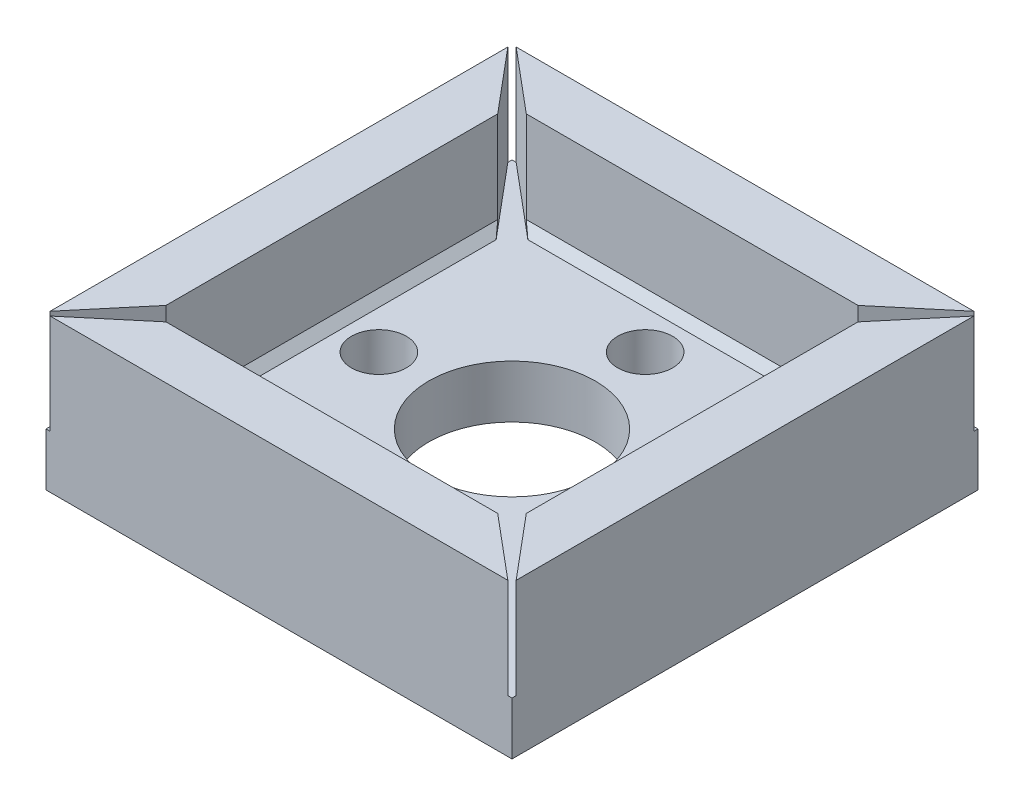
ISO-10303-21;
HEADER;
FILE_DESCRIPTION(('STEP AP214'),'2;1');
FILE_NAME('part.step','',(''),(''),'','','');
FILE_SCHEMA(('AUTOMOTIVE_DESIGN { 1 0 10303 214 1 1 1 1 }'));
ENDSEC;
DATA;
#1=APPLICATION_CONTEXT('core data for automotive mechanical design processes');
#2=APPLICATION_PROTOCOL_DEFINITION('international standard','automotive_design',2000,#1);
#3=PRODUCT_CONTEXT('',#1,'mechanical');
#4=PRODUCT('Part','Part','',(#3));
#5=PRODUCT_RELATED_PRODUCT_CATEGORY('part','',(#4));
#6=PRODUCT_DEFINITION_FORMATION('','',#4);
#7=PRODUCT_DEFINITION_CONTEXT('part definition',#1,'design');
#8=PRODUCT_DEFINITION('design','',#6,#7);
#9=PRODUCT_DEFINITION_SHAPE('','',#8);
#10=(LENGTH_UNIT() NAMED_UNIT(*) SI_UNIT(.MILLI.,.METRE.));
#11=(NAMED_UNIT(*) PLANE_ANGLE_UNIT() SI_UNIT($,.RADIAN.));
#12=(NAMED_UNIT(*) SI_UNIT($,.STERADIAN.) SOLID_ANGLE_UNIT());
#13=UNCERTAINTY_MEASURE_WITH_UNIT(LENGTH_MEASURE(1.E-05),#10,'distance_accuracy_value','');
#14=(GEOMETRIC_REPRESENTATION_CONTEXT(3) GLOBAL_UNCERTAINTY_ASSIGNED_CONTEXT((#13)) GLOBAL_UNIT_ASSIGNED_CONTEXT((#10,
#11,#12)) REPRESENTATION_CONTEXT('',''));
#15=CARTESIAN_POINT('',(0.,0.,0.));
#16=DIRECTION('',(0.,0.,1.));
#17=DIRECTION('',(1.,0.,0.));
#18=AXIS2_PLACEMENT_3D('',#15,#16,#17);
#19=CARTESIAN_POINT('',(0.,3.175,0.));
#20=DIRECTION('',(0.,-1.,0.));
#21=DIRECTION('',(0.,0.,-1.));
#22=AXIS2_PLACEMENT_3D('',#19,#20,#21);
#23=PLANE('',#22);
#24=CARTESIAN_POINT('',(8.,3.175,0.));
#25=DIRECTION('',(0.,1.,0.));
#26=DIRECTION('',(0.,0.,1.));
#27=AXIS2_PLACEMENT_3D('',#24,#25,#26);
#28=CIRCLE('',#27,1.64999999999999);
#29=CARTESIAN_POINT('',(8.,3.175,1.64999999999998));
#30=VERTEX_POINT('',#29);
#31=EDGE_CURVE('E346',#30,#30,#28,.T.);
#32=ORIENTED_EDGE('',*,*,#31,.F.);
#33=EDGE_LOOP('',(#32));
#34=FACE_BOUND('',#33,.T.);
#35=CARTESIAN_POINT('',(0.,3.175,7.99999999999999));
#36=DIRECTION('',(0.,1.,0.));
#37=DIRECTION('',(0.,0.,1.));
#38=AXIS2_PLACEMENT_3D('',#35,#36,#37);
#39=CIRCLE('',#38,1.64999999999999);
#40=CARTESIAN_POINT('',(0.,3.175,9.64999999999998));
#41=VERTEX_POINT('',#40);
#42=EDGE_CURVE('E351',#41,#41,#39,.T.);
#43=ORIENTED_EDGE('',*,*,#42,.F.);
#44=EDGE_LOOP('',(#43));
#45=FACE_BOUND('',#44,.T.);
#46=CARTESIAN_POINT('',(-8.,3.175,0.));
#47=DIRECTION('',(0.,1.,0.));
#48=DIRECTION('',(0.,0.,1.));
#49=AXIS2_PLACEMENT_3D('',#46,#47,#48);
#50=CIRCLE('',#49,1.64999999999999);
#51=CARTESIAN_POINT('',(-8.,3.175,1.64999999999993));
#52=VERTEX_POINT('',#51);
#53=EDGE_CURVE('E359',#52,#52,#50,.T.);
#54=ORIENTED_EDGE('',*,*,#53,.F.);
#55=EDGE_LOOP('',(#54));
#56=FACE_BOUND('',#55,.T.);
#57=CARTESIAN_POINT('',(0.,3.175,-8.00000000000001));
#58=DIRECTION('',(0.,1.,0.));
#59=DIRECTION('',(0.,0.,1.));
#60=AXIS2_PLACEMENT_3D('',#57,#58,#59);
#61=CIRCLE('',#60,1.64999999999999);
#62=CARTESIAN_POINT('',(0.,3.175,-6.35000000000002));
#63=VERTEX_POINT('',#62);
#64=EDGE_CURVE('E364',#63,#63,#61,.T.);
#65=ORIENTED_EDGE('',*,*,#64,.F.);
#66=EDGE_LOOP('',(#65));
#67=FACE_BOUND('',#66,.T.);
#68=CARTESIAN_POINT('',(0.,3.175,0.));
#69=DIRECTION('',(0.,1.,0.));
#70=DIRECTION('',(0.,0.,1.));
#71=AXIS2_PLACEMENT_3D('',#68,#69,#70);
#72=CIRCLE('',#71,5.);
#73=CARTESIAN_POINT('',(0.,3.175,5.));
#74=VERTEX_POINT('',#73);
#75=EDGE_CURVE('E372',#74,#74,#72,.T.);
#76=ORIENTED_EDGE('',*,*,#75,.F.);
#77=EDGE_LOOP('',(#76));
#78=FACE_BOUND('',#77,.T.);
#79=DIRECTION('',(-0.766044443118974,0.,0.642787609686544));
#80=VECTOR('',#79,1.);
#81=CARTESIAN_POINT('',(-13.75,3.175,14.));
#82=LINE('',#81,#80);
#83=CARTESIAN_POINT('',(-9.37030554721633,3.175,10.325));
#84=VERTEX_POINT('',#83);
#85=CARTESIAN_POINT('',(-13.75,3.175,14.));
#86=VERTEX_POINT('',#85);
#87=EDGE_CURVE('E310',#84,#86,#82,.T.);
#88=ORIENTED_EDGE('',*,*,#87,.F.);
#89=DIRECTION('',(1.,0.,0.));
#90=VECTOR('',#89,1.);
#91=CARTESIAN_POINT('',(9.96618234351338,3.175,10.325));
#92=LINE('',#91,#90);
#93=CARTESIAN_POINT('',(9.37030554721627,3.175,10.325));
#94=VERTEX_POINT('',#93);
#95=EDGE_CURVE('E447',#84,#94,#92,.T.);
#96=ORIENTED_EDGE('',*,*,#95,.T.);
#97=DIRECTION('',(-0.766044443118979,0.,-0.642787609686538));
#98=VECTOR('',#97,1.);
#99=CARTESIAN_POINT('',(13.75,3.175,14.));
#100=LINE('',#99,#98);
#101=CARTESIAN_POINT('',(13.75,3.175,14.));
#102=VERTEX_POINT('',#101);
#103=EDGE_CURVE('E316',#102,#94,#100,.T.);
#104=ORIENTED_EDGE('',*,*,#103,.F.);
#105=DIRECTION('',(1.,0.,0.));
#106=VECTOR('',#105,1.);
#107=CARTESIAN_POINT('',(-14.,3.175,14.));
#108=LINE('',#107,#106);
#109=CARTESIAN_POINT('',(14.,3.175,14.));
#110=VERTEX_POINT('',#109);
#111=EDGE_CURVE('E393',#102,#110,#108,.T.);
#112=ORIENTED_EDGE('',*,*,#111,.T.);
#113=DIRECTION('',(0.,0.,-1.));
#114=VECTOR('',#113,1.);
#115=CARTESIAN_POINT('',(14.,3.175,14.));
#116=LINE('',#115,#114);
#117=CARTESIAN_POINT('',(14.,3.175,13.75));
#118=VERTEX_POINT('',#117);
#119=EDGE_CURVE('E381',#110,#118,#116,.T.);
#120=ORIENTED_EDGE('',*,*,#119,.T.);
#121=DIRECTION('',(0.642787609686546,0.,0.766044443118972));
#122=VECTOR('',#121,1.);
#123=CARTESIAN_POINT('',(14.,3.175,13.75));
#124=LINE('',#123,#122);
#125=CARTESIAN_POINT('',(10.325,3.175,9.3703055472163));
#126=VERTEX_POINT('',#125);
#127=EDGE_CURVE('E274',#126,#118,#124,.T.);
#128=ORIENTED_EDGE('',*,*,#127,.F.);
#129=DIRECTION('',(0.,0.,-1.));
#130=VECTOR('',#129,1.);
#131=CARTESIAN_POINT('',(10.325,3.175,-9.96618234351341));
#132=LINE('',#131,#130);
#133=CARTESIAN_POINT('',(10.325,3.175,-9.37030554721631));
#134=VERTEX_POINT('',#133);
#135=EDGE_CURVE('E443',#126,#134,#132,.T.);
#136=ORIENTED_EDGE('',*,*,#135,.T.);
#137=DIRECTION('',(-0.642787609686535,0.,0.766044443118981));
#138=VECTOR('',#137,1.);
#139=CARTESIAN_POINT('',(13.9999999999999,3.175,-13.75));
#140=LINE('',#139,#138);
#141=CARTESIAN_POINT('',(13.9999999999999,3.175,-13.75));
#142=VERTEX_POINT('',#141);
#143=EDGE_CURVE('E280',#142,#134,#140,.T.);
#144=ORIENTED_EDGE('',*,*,#143,.F.);
#145=CARTESIAN_POINT('',(14.,3.175,-14.));
#146=VERTEX_POINT('',#145);
#147=EDGE_CURVE('E385',#142,#146,#116,.T.);
#148=ORIENTED_EDGE('',*,*,#147,.T.);
#149=DIRECTION('',(-1.,0.,0.));
#150=VECTOR('',#149,1.);
#151=CARTESIAN_POINT('',(-14.,3.175,-14.));
#152=LINE('',#151,#150);
#153=CARTESIAN_POINT('',(13.75,3.175,-14.));
#154=VERTEX_POINT('',#153);
#155=EDGE_CURVE('E386',#146,#154,#152,.T.);
#156=ORIENTED_EDGE('',*,*,#155,.T.);
#157=DIRECTION('',(0.766044443118974,0.,-0.642787609686544));
#158=VECTOR('',#157,1.);
#159=CARTESIAN_POINT('',(13.75,3.175,-14.));
#160=LINE('',#159,#158);
#161=CARTESIAN_POINT('',(9.37030554721633,3.175,-10.325));
#162=VERTEX_POINT('',#161);
#163=EDGE_CURVE('E232',#162,#154,#160,.T.);
#164=ORIENTED_EDGE('',*,*,#163,.F.);
#165=DIRECTION('',(-1.,0.,0.));
#166=VECTOR('',#165,1.);
#167=CARTESIAN_POINT('',(-9.96618234351338,3.175,-10.325));
#168=LINE('',#167,#166);
#169=CARTESIAN_POINT('',(-9.37030554721627,3.175,-10.325));
#170=VERTEX_POINT('',#169);
#171=EDGE_CURVE('E439',#162,#170,#168,.T.);
#172=ORIENTED_EDGE('',*,*,#171,.T.);
#173=DIRECTION('',(0.766044443118979,0.,0.642787609686538));
#174=VECTOR('',#173,1.);
#175=CARTESIAN_POINT('',(-13.75,3.175,-14.));
#176=LINE('',#175,#174);
#177=CARTESIAN_POINT('',(-13.75,3.175,-14.));
#178=VERTEX_POINT('',#177);
#179=EDGE_CURVE('E237',#178,#170,#176,.T.);
#180=ORIENTED_EDGE('',*,*,#179,.F.);
#181=CARTESIAN_POINT('',(-14.,3.175,-14.));
#182=VERTEX_POINT('',#181);
#183=EDGE_CURVE('E384',#178,#182,#152,.T.);
#184=ORIENTED_EDGE('',*,*,#183,.T.);
#185=DIRECTION('',(0.,0.,1.));
#186=VECTOR('',#185,1.);
#187=CARTESIAN_POINT('',(-14.,3.175,14.));
#188=LINE('',#187,#186);
#189=CARTESIAN_POINT('',(-14.,3.175,-13.7499999999999));
#190=VERTEX_POINT('',#189);
#191=EDGE_CURVE('E390',#182,#190,#188,.T.);
#192=ORIENTED_EDGE('',*,*,#191,.T.);
#193=DIRECTION('',(-0.642787609686552,0.,-0.766044443118967));
#194=VECTOR('',#193,1.);
#195=CARTESIAN_POINT('',(-14.0000000000001,3.175,-13.7499999999999));
#196=LINE('',#195,#194);
#197=CARTESIAN_POINT('',(-10.3250000000001,3.175,-9.37030554721623));
#198=VERTEX_POINT('',#197);
#199=EDGE_CURVE('E230',#198,#190,#196,.T.);
#200=ORIENTED_EDGE('',*,*,#199,.F.);
#201=DIRECTION('',(0.,0.,1.));
#202=VECTOR('',#201,1.);
#203=CARTESIAN_POINT('',(-10.3249999999999,3.175,9.96618234351349));
#204=LINE('',#203,#202);
#205=CARTESIAN_POINT('',(-10.3249999999999,3.175,9.37030554721638));
#206=VERTEX_POINT('',#205);
#207=EDGE_CURVE('E435',#198,#206,#204,.T.);
#208=ORIENTED_EDGE('',*,*,#207,.T.);
#209=DIRECTION('',(0.64278760968653,0.,-0.766044443118986));
#210=VECTOR('',#209,1.);
#211=CARTESIAN_POINT('',(-13.9999999999998,3.175,13.7500000000001));
#212=LINE('',#211,#210);
#213=CARTESIAN_POINT('',(-13.9999999999998,3.175,13.7500000000001));
#214=VERTEX_POINT('',#213);
#215=EDGE_CURVE('E227',#214,#206,#212,.T.);
#216=ORIENTED_EDGE('',*,*,#215,.F.);
#217=CARTESIAN_POINT('',(-14.,3.175,14.));
#218=VERTEX_POINT('',#217);
#219=EDGE_CURVE('E389',#214,#218,#188,.T.);
#220=ORIENTED_EDGE('',*,*,#219,.T.);
#221=EDGE_CURVE('E394',#218,#86,#108,.T.);
#222=ORIENTED_EDGE('',*,*,#221,.T.);
#223=EDGE_LOOP('',(#88,#96,#104,#112,#120,#128,#136,#144,#148,#156,#164,#172,#180,#184,#192,
#200,#208,#216,#220,#222));
#224=FACE_BOUND('',#223,.T.);
#225=ADVANCED_FACE('F41',(#34,#45,#56,#67,#78,#224),#23,.F.);
#226=CARTESIAN_POINT('',(14.,3.175,14.));
#227=DIRECTION('',(-1.,0.,0.));
#228=DIRECTION('',(0.,0.,1.));
#229=AXIS2_PLACEMENT_3D('',#226,#227,#228);
#230=PLANE('',#229);
#231=DIRECTION('',(0.,0.,-1.));
#232=VECTOR('',#231,1.);
#233=CARTESIAN_POINT('',(14.,0.,14.));
#234=LINE('',#233,#232);
#235=CARTESIAN_POINT('',(14.,0.,14.));
#236=VERTEX_POINT('',#235);
#237=CARTESIAN_POINT('',(14.,0.,-14.));
#238=VERTEX_POINT('',#237);
#239=EDGE_CURVE('E377',#236,#238,#234,.T.);
#240=ORIENTED_EDGE('',*,*,#239,.T.);
#241=DIRECTION('',(0.,-1.,0.));
#242=VECTOR('',#241,1.);
#243=CARTESIAN_POINT('',(14.,3.175,-14.));
#244=LINE('',#243,#242);
#245=EDGE_CURVE('E421',#146,#238,#244,.T.);
#246=ORIENTED_EDGE('',*,*,#245,.F.);
#247=ORIENTED_EDGE('',*,*,#147,.F.);
#248=DIRECTION('',(0.,-1.,0.));
#249=VECTOR('',#248,1.);
#250=CARTESIAN_POINT('',(13.9999999999999,9.175,-13.75));
#251=LINE('',#250,#249);
#252=CARTESIAN_POINT('',(13.9999999999999,9.175,-13.75));
#253=VERTEX_POINT('',#252);
#254=EDGE_CURVE('E302',#253,#142,#251,.T.);
#255=ORIENTED_EDGE('',*,*,#254,.F.);
#256=DIRECTION('',(0.,0.,-1.));
#257=VECTOR('',#256,1.);
#258=CARTESIAN_POINT('',(14.,9.175,13.75));
#259=LINE('',#258,#257);
#260=CARTESIAN_POINT('',(14.,9.175,13.75));
#261=VERTEX_POINT('',#260);
#262=EDGE_CURVE('E279',#261,#253,#259,.T.);
#263=ORIENTED_EDGE('',*,*,#262,.F.);
#264=DIRECTION('',(0.,-1.,0.));
#265=VECTOR('',#264,1.);
#266=CARTESIAN_POINT('',(14.,9.175,13.75));
#267=LINE('',#266,#265);
#268=EDGE_CURVE('E306',#261,#118,#267,.T.);
#269=ORIENTED_EDGE('',*,*,#268,.T.);
#270=ORIENTED_EDGE('',*,*,#119,.F.);
#271=DIRECTION('',(0.,-1.,0.));
#272=VECTOR('',#271,1.);
#273=CARTESIAN_POINT('',(14.,3.175,14.));
#274=LINE('',#273,#272);
#275=EDGE_CURVE('E397',#110,#236,#274,.T.);
#276=ORIENTED_EDGE('',*,*,#275,.T.);
#277=EDGE_LOOP('',(#240,#246,#247,#255,#263,#269,#270,#276));
#278=FACE_BOUND('',#277,.T.);
#279=ADVANCED_FACE('F510',(#278),#230,.F.);
#280=CARTESIAN_POINT('',(-14.,3.175,-14.));
#281=DIRECTION('',(0.,0.,1.));
#282=DIRECTION('',(1.,0.,0.));
#283=AXIS2_PLACEMENT_3D('',#280,#281,#282);
#284=PLANE('',#283);
#285=DIRECTION('',(-1.,0.,0.));
#286=VECTOR('',#285,1.);
#287=CARTESIAN_POINT('',(-14.,0.,-14.));
#288=LINE('',#287,#286);
#289=CARTESIAN_POINT('',(-14.,0.,-14.));
#290=VERTEX_POINT('',#289);
#291=EDGE_CURVE('E401',#238,#290,#288,.T.);
#292=ORIENTED_EDGE('',*,*,#291,.T.);
#293=DIRECTION('',(0.,-1.,0.));
#294=VECTOR('',#293,1.);
#295=CARTESIAN_POINT('',(-14.,3.175,-14.));
#296=LINE('',#295,#294);
#297=EDGE_CURVE('E417',#182,#290,#296,.T.);
#298=ORIENTED_EDGE('',*,*,#297,.F.);
#299=ORIENTED_EDGE('',*,*,#183,.F.);
#300=DIRECTION('',(0.,-1.,0.));
#301=VECTOR('',#300,1.);
#302=CARTESIAN_POINT('',(-13.75,9.175,-14.));
#303=LINE('',#302,#301);
#304=CARTESIAN_POINT('',(-13.75,9.175,-14.));
#305=VERTEX_POINT('',#304);
#306=EDGE_CURVE('E266',#305,#178,#303,.T.);
#307=ORIENTED_EDGE('',*,*,#306,.F.);
#308=DIRECTION('',(-1.,0.,0.));
#309=VECTOR('',#308,1.);
#310=CARTESIAN_POINT('',(13.75,9.175,-14.));
#311=LINE('',#310,#309);
#312=CARTESIAN_POINT('',(13.75,9.175,-14.));
#313=VERTEX_POINT('',#312);
#314=EDGE_CURVE('E247',#313,#305,#311,.T.);
#315=ORIENTED_EDGE('',*,*,#314,.F.);
#316=DIRECTION('',(0.,-1.,0.));
#317=VECTOR('',#316,1.);
#318=CARTESIAN_POINT('',(13.75,9.175,-14.));
#319=LINE('',#318,#317);
#320=EDGE_CURVE('E270',#313,#154,#319,.T.);
#321=ORIENTED_EDGE('',*,*,#320,.T.);
#322=ORIENTED_EDGE('',*,*,#155,.F.);
#323=ORIENTED_EDGE('',*,*,#245,.T.);
#324=EDGE_LOOP('',(#292,#298,#299,#307,#315,#321,#322,#323));
#325=FACE_BOUND('',#324,.T.);
#326=ADVANCED_FACE('F516',(#325),#284,.F.);
#327=CARTESIAN_POINT('',(-14.,3.175,14.));
#328=DIRECTION('',(1.,0.,0.));
#329=DIRECTION('',(0.,0.,-1.));
#330=AXIS2_PLACEMENT_3D('',#327,#328,#329);
#331=PLANE('',#330);
#332=DIRECTION('',(0.,0.,1.));
#333=VECTOR('',#332,1.);
#334=CARTESIAN_POINT('',(-14.,0.,14.));
#335=LINE('',#334,#333);
#336=CARTESIAN_POINT('',(-14.,0.,14.));
#337=VERTEX_POINT('',#336);
#338=EDGE_CURVE('E404',#290,#337,#335,.T.);
#339=ORIENTED_EDGE('',*,*,#338,.T.);
#340=DIRECTION('',(0.,-1.,0.));
#341=VECTOR('',#340,1.);
#342=CARTESIAN_POINT('',(-14.,3.175,14.));
#343=LINE('',#342,#341);
#344=EDGE_CURVE('E413',#218,#337,#343,.T.);
#345=ORIENTED_EDGE('',*,*,#344,.F.);
#346=ORIENTED_EDGE('',*,*,#219,.F.);
#347=DIRECTION('',(0.,-1.,0.));
#348=VECTOR('',#347,1.);
#349=CARTESIAN_POINT('',(-13.9999999999998,9.175,13.7500000000001));
#350=LINE('',#349,#348);
#351=CARTESIAN_POINT('',(-13.9999999999998,9.175,13.7500000000001));
#352=VERTEX_POINT('',#351);
#353=EDGE_CURVE('E212',#352,#214,#350,.T.);
#354=ORIENTED_EDGE('',*,*,#353,.F.);
#355=DIRECTION('',(0.,0.,1.));
#356=VECTOR('',#355,1.);
#357=CARTESIAN_POINT('',(-14.0000000000001,9.175,-13.7499999999999));
#358=LINE('',#357,#356);
#359=CARTESIAN_POINT('',(-14.0000000000001,9.175,-13.7499999999999));
#360=VERTEX_POINT('',#359);
#361=EDGE_CURVE('E204',#360,#352,#358,.T.);
#362=ORIENTED_EDGE('',*,*,#361,.F.);
#363=DIRECTION('',(0.,-1.,0.));
#364=VECTOR('',#363,1.);
#365=CARTESIAN_POINT('',(-14.0000000000001,9.175,-13.7499999999999));
#366=LINE('',#365,#364);
#367=EDGE_CURVE('E209',#360,#190,#366,.T.);
#368=ORIENTED_EDGE('',*,*,#367,.T.);
#369=ORIENTED_EDGE('',*,*,#191,.F.);
#370=ORIENTED_EDGE('',*,*,#297,.T.);
#371=EDGE_LOOP('',(#339,#345,#346,#354,#362,#368,#369,#370));
#372=FACE_BOUND('',#371,.T.);
#373=ADVANCED_FACE('F206',(#372),#331,.F.);
#374=CARTESIAN_POINT('',(-14.,3.175,14.));
#375=DIRECTION('',(0.,0.,-1.));
#376=DIRECTION('',(-1.,0.,0.));
#377=AXIS2_PLACEMENT_3D('',#374,#375,#376);
#378=PLANE('',#377);
#379=DIRECTION('',(1.,0.,0.));
#380=VECTOR('',#379,1.);
#381=CARTESIAN_POINT('',(-14.,0.,14.));
#382=LINE('',#381,#380);
#383=EDGE_CURVE('E407',#337,#236,#382,.T.);
#384=ORIENTED_EDGE('',*,*,#383,.T.);
#385=ORIENTED_EDGE('',*,*,#275,.F.);
#386=ORIENTED_EDGE('',*,*,#111,.F.);
#387=DIRECTION('',(0.,-1.,0.));
#388=VECTOR('',#387,1.);
#389=CARTESIAN_POINT('',(13.75,9.175,14.));
#390=LINE('',#389,#388);
#391=CARTESIAN_POINT('',(13.75,9.175,14.));
#392=VERTEX_POINT('',#391);
#393=EDGE_CURVE('E338',#392,#102,#390,.T.);
#394=ORIENTED_EDGE('',*,*,#393,.F.);
#395=DIRECTION('',(1.,0.,0.));
#396=VECTOR('',#395,1.);
#397=CARTESIAN_POINT('',(-13.75,9.175,14.));
#398=LINE('',#397,#396);
#399=CARTESIAN_POINT('',(-13.75,9.175,14.));
#400=VERTEX_POINT('',#399);
#401=EDGE_CURVE('E315',#400,#392,#398,.T.);
#402=ORIENTED_EDGE('',*,*,#401,.F.);
#403=DIRECTION('',(0.,-1.,0.));
#404=VECTOR('',#403,1.);
#405=CARTESIAN_POINT('',(-13.75,9.175,14.));
#406=LINE('',#405,#404);
#407=EDGE_CURVE('E342',#400,#86,#406,.T.);
#408=ORIENTED_EDGE('',*,*,#407,.T.);
#409=ORIENTED_EDGE('',*,*,#221,.F.);
#410=ORIENTED_EDGE('',*,*,#344,.T.);
#411=EDGE_LOOP('',(#384,#385,#386,#394,#402,#408,#409,#410));
#412=FACE_BOUND('',#411,.T.);
#413=ADVANCED_FACE('F528',(#412),#378,.F.);
#414=CARTESIAN_POINT('',(0.,0.,0.));
#415=DIRECTION('',(0.,-1.,0.));
#416=DIRECTION('',(0.,0.,-1.));
#417=AXIS2_PLACEMENT_3D('',#414,#415,#416);
#418=PLANE('',#417);
#419=CARTESIAN_POINT('',(8.,0.,0.));
#420=DIRECTION('',(0.,-1.,0.));
#421=DIRECTION('',(0.,0.,-1.));
#422=AXIS2_PLACEMENT_3D('',#419,#420,#421);
#423=CIRCLE('',#422,1.64999999999999);
#424=CARTESIAN_POINT('',(8.,0.,-1.65));
#425=VERTEX_POINT('',#424);
#426=EDGE_CURVE('E350',#425,#425,#423,.T.);
#427=ORIENTED_EDGE('',*,*,#426,.F.);
#428=EDGE_LOOP('',(#427));
#429=FACE_BOUND('',#428,.T.);
#430=CARTESIAN_POINT('',(0.,0.,7.99999999999999));
#431=DIRECTION('',(0.,-1.,0.));
#432=DIRECTION('',(0.,0.,-1.));
#433=AXIS2_PLACEMENT_3D('',#430,#431,#432);
#434=CIRCLE('',#433,1.64999999999999);
#435=CARTESIAN_POINT('',(0.,0.,6.35000000000001));
#436=VERTEX_POINT('',#435);
#437=EDGE_CURVE('E355',#436,#436,#434,.T.);
#438=ORIENTED_EDGE('',*,*,#437,.F.);
#439=EDGE_LOOP('',(#438));
#440=FACE_BOUND('',#439,.T.);
#441=CARTESIAN_POINT('',(-8.,0.,0.));
#442=DIRECTION('',(0.,-1.,0.));
#443=DIRECTION('',(0.,0.,-1.));
#444=AXIS2_PLACEMENT_3D('',#441,#442,#443);
#445=CIRCLE('',#444,1.64999999999999);
#446=CARTESIAN_POINT('',(-8.,0.,-1.65000000000005));
#447=VERTEX_POINT('',#446);
#448=EDGE_CURVE('E363',#447,#447,#445,.T.);
#449=ORIENTED_EDGE('',*,*,#448,.F.);
#450=EDGE_LOOP('',(#449));
#451=FACE_BOUND('',#450,.T.);
#452=CARTESIAN_POINT('',(0.,0.,-8.00000000000001));
#453=DIRECTION('',(0.,-1.,0.));
#454=DIRECTION('',(0.,0.,-1.));
#455=AXIS2_PLACEMENT_3D('',#452,#453,#454);
#456=CIRCLE('',#455,1.64999999999999);
#457=CARTESIAN_POINT('',(0.,0.,-9.65));
#458=VERTEX_POINT('',#457);
#459=EDGE_CURVE('E368',#458,#458,#456,.T.);
#460=ORIENTED_EDGE('',*,*,#459,.F.);
#461=EDGE_LOOP('',(#460));
#462=FACE_BOUND('',#461,.T.);
#463=CARTESIAN_POINT('',(0.,0.,0.));
#464=DIRECTION('',(0.,1.,0.));
#465=DIRECTION('',(0.,0.,1.));
#466=AXIS2_PLACEMENT_3D('',#463,#464,#465);
#467=CIRCLE('',#466,5.);
#468=CARTESIAN_POINT('',(0.,0.,5.));
#469=VERTEX_POINT('',#468);
#470=EDGE_CURVE('E373',#469,#469,#467,.T.);
#471=ORIENTED_EDGE('',*,*,#470,.T.);
#472=EDGE_LOOP('',(#471));
#473=FACE_BOUND('',#472,.T.);
#474=ORIENTED_EDGE('',*,*,#239,.F.);
#475=ORIENTED_EDGE('',*,*,#383,.F.);
#476=ORIENTED_EDGE('',*,*,#338,.F.);
#477=ORIENTED_EDGE('',*,*,#291,.F.);
#478=EDGE_LOOP('',(#474,#475,#476,#477));
#479=FACE_BOUND('',#478,.T.);
#480=ADVANCED_FACE('F525',(#429,#440,#451,#462,#473,#479),#418,.T.);
#481=CARTESIAN_POINT('',(0.,0.,0.));
#482=DIRECTION('',(0.,1.,0.));
#483=DIRECTION('',(0.,0.,1.));
#484=AXIS2_PLACEMENT_3D('',#481,#482,#483);
#485=CYLINDRICAL_SURFACE('',#484,5.);
#486=ORIENTED_EDGE('',*,*,#470,.F.);
#487=EDGE_LOOP('',(#486));
#488=FACE_BOUND('',#487,.T.);
#489=ORIENTED_EDGE('',*,*,#75,.T.);
#490=EDGE_LOOP('',(#489));
#491=FACE_BOUND('',#490,.T.);
#492=ADVANCED_FACE('F523',(#488,#491),#485,.F.);
#493=CARTESIAN_POINT('',(0.,3.175,-8.00000000000001));
#494=DIRECTION('',(0.,1.,0.));
#495=DIRECTION('',(0.,0.,1.));
#496=AXIS2_PLACEMENT_3D('',#493,#494,#495);
#497=CYLINDRICAL_SURFACE('',#496,1.64999999999999);
#498=ORIENTED_EDGE('',*,*,#459,.T.);
#499=EDGE_LOOP('',(#498));
#500=FACE_BOUND('',#499,.T.);
#501=ORIENTED_EDGE('',*,*,#64,.T.);
#502=EDGE_LOOP('',(#501));
#503=FACE_BOUND('',#502,.T.);
#504=ADVANCED_FACE('F650',(#500,#503),#497,.F.);
#505=CARTESIAN_POINT('',(-8.,3.175,0.));
#506=DIRECTION('',(0.,1.,0.));
#507=DIRECTION('',(0.,0.,1.));
#508=AXIS2_PLACEMENT_3D('',#505,#506,#507);
#509=CYLINDRICAL_SURFACE('',#508,1.64999999999999);
#510=ORIENTED_EDGE('',*,*,#448,.T.);
#511=EDGE_LOOP('',(#510));
#512=FACE_BOUND('',#511,.T.);
#513=ORIENTED_EDGE('',*,*,#53,.T.);
#514=EDGE_LOOP('',(#513));
#515=FACE_BOUND('',#514,.T.);
#516=ADVANCED_FACE('F647',(#512,#515),#509,.F.);
#517=CARTESIAN_POINT('',(0.,3.175,7.99999999999999));
#518=DIRECTION('',(0.,1.,0.));
#519=DIRECTION('',(0.,0.,1.));
#520=AXIS2_PLACEMENT_3D('',#517,#518,#519);
#521=CYLINDRICAL_SURFACE('',#520,1.64999999999999);
#522=ORIENTED_EDGE('',*,*,#437,.T.);
#523=EDGE_LOOP('',(#522));
#524=FACE_BOUND('',#523,.T.);
#525=ORIENTED_EDGE('',*,*,#42,.T.);
#526=EDGE_LOOP('',(#525));
#527=FACE_BOUND('',#526,.T.);
#528=ADVANCED_FACE('F643',(#524,#527),#521,.F.);
#529=CARTESIAN_POINT('',(8.,3.175,0.));
#530=DIRECTION('',(0.,1.,0.));
#531=DIRECTION('',(0.,0.,1.));
#532=AXIS2_PLACEMENT_3D('',#529,#530,#531);
#533=CYLINDRICAL_SURFACE('',#532,1.64999999999999);
#534=ORIENTED_EDGE('',*,*,#426,.T.);
#535=EDGE_LOOP('',(#534));
#536=FACE_BOUND('',#535,.T.);
#537=ORIENTED_EDGE('',*,*,#31,.T.);
#538=EDGE_LOOP('',(#537));
#539=FACE_BOUND('',#538,.T.);
#540=ADVANCED_FACE('F640',(#536,#539),#533,.F.);
#541=CARTESIAN_POINT('',(-13.75,9.175,14.));
#542=DIRECTION('',(0.642787609686544,0.,0.766044443118974));
#543=DIRECTION('',(0.766044443118974,0.,-0.642787609686544));
#544=AXIS2_PLACEMENT_3D('',#541,#542,#543);
#545=PLANE('',#544);
#546=ORIENTED_EDGE('',*,*,#87,.T.);
#547=ORIENTED_EDGE('',*,*,#407,.F.);
#548=DIRECTION('',(-0.766044443118974,0.,0.642787609686544));
#549=VECTOR('',#548,1.);
#550=CARTESIAN_POINT('',(-13.75,9.175,14.));
#551=LINE('',#550,#549);
#552=CARTESIAN_POINT('',(-9.96618234351343,9.175,10.825));
#553=VERTEX_POINT('',#552);
#554=EDGE_CURVE('E311',#553,#400,#551,.T.);
#555=ORIENTED_EDGE('',*,*,#554,.F.);
#556=DIRECTION('',(0.,-1.,0.));
#557=VECTOR('',#556,1.);
#558=CARTESIAN_POINT('',(-9.96618234351343,9.175,10.825));
#559=LINE('',#558,#557);
#560=CARTESIAN_POINT('',(-9.96618234351343,3.67500000000001,10.825));
#561=VERTEX_POINT('',#560);
#562=EDGE_CURVE('E325',#553,#561,#559,.T.);
#563=ORIENTED_EDGE('',*,*,#562,.T.);
#564=DIRECTION('',(-0.644400477571765,0.540716203060944,0.540716203060938));
#565=VECTOR('',#564,1.);
#566=CARTESIAN_POINT('',(-14.5601178372986,7.52976957848743,14.6797695784874));
#567=LINE('',#566,#565);
#568=EDGE_CURVE('E462',#561,#84,#567,.F.);
#569=ORIENTED_EDGE('',*,*,#568,.T.);
#570=EDGE_LOOP('',(#546,#547,#555,#563,#569));
#571=FACE_BOUND('',#570,.T.);
#572=ADVANCED_FACE('F622',(#571),#545,.F.);
#573=CARTESIAN_POINT('',(13.75,9.175,14.));
#574=DIRECTION('',(-0.642787609686538,0.,0.766044443118979));
#575=DIRECTION('',(0.766044443118979,0.,0.642787609686538));
#576=AXIS2_PLACEMENT_3D('',#573,#574,#575);
#577=PLANE('',#576);
#578=ORIENTED_EDGE('',*,*,#103,.T.);
#579=DIRECTION('',(-0.644400477571771,-0.540716203060941,-0.540716203060934));
#580=VECTOR('',#579,1.);
#581=CARTESIAN_POINT('',(14.5601178372986,7.52976957848742,14.6797695784874));
#582=LINE('',#581,#580);
#583=CARTESIAN_POINT('',(9.96618234351338,3.67500000000001,10.825));
#584=VERTEX_POINT('',#583);
#585=EDGE_CURVE('E466',#94,#584,#582,.F.);
#586=ORIENTED_EDGE('',*,*,#585,.T.);
#587=DIRECTION('',(0.,-1.,0.));
#588=VECTOR('',#587,1.);
#589=CARTESIAN_POINT('',(9.96618234351338,9.175,10.825));
#590=LINE('',#589,#588);
#591=CARTESIAN_POINT('',(9.96618234351338,9.175,10.825));
#592=VERTEX_POINT('',#591);
#593=EDGE_CURVE('E334',#592,#584,#590,.T.);
#594=ORIENTED_EDGE('',*,*,#593,.F.);
#595=DIRECTION('',(-0.766044443118979,0.,-0.642787609686538));
#596=VECTOR('',#595,1.);
#597=CARTESIAN_POINT('',(13.75,9.175,14.));
#598=LINE('',#597,#596);
#599=EDGE_CURVE('E319',#392,#592,#598,.T.);
#600=ORIENTED_EDGE('',*,*,#599,.F.);
#601=ORIENTED_EDGE('',*,*,#393,.T.);
#602=EDGE_LOOP('',(#578,#586,#594,#600,#601));
#603=FACE_BOUND('',#602,.T.);
#604=ADVANCED_FACE('F614',(#603),#577,.F.);
#605=CARTESIAN_POINT('',(9.96618234351338,9.175,10.825));
#606=DIRECTION('',(0.,0.,1.));
#607=DIRECTION('',(1.,0.,0.));
#608=AXIS2_PLACEMENT_3D('',#605,#606,#607);
#609=PLANE('',#608);
#610=ORIENTED_EDGE('',*,*,#593,.T.);
#611=DIRECTION('',(-1.,0.,0.));
#612=VECTOR('',#611,1.);
#613=CARTESIAN_POINT('',(-9.96618234351343,3.67500000000001,10.825));
#614=LINE('',#613,#612);
#615=EDGE_CURVE('E425',#584,#561,#614,.T.);
#616=ORIENTED_EDGE('',*,*,#615,.T.);
#617=ORIENTED_EDGE('',*,*,#562,.F.);
#618=DIRECTION('',(-1.,0.,0.));
#619=VECTOR('',#618,1.);
#620=CARTESIAN_POINT('',(9.96618234351338,9.175,10.825));
#621=LINE('',#620,#619);
#622=EDGE_CURVE('E322',#592,#553,#621,.T.);
#623=ORIENTED_EDGE('',*,*,#622,.F.);
#624=EDGE_LOOP('',(#610,#616,#617,#623));
#625=FACE_BOUND('',#624,.T.);
#626=ADVANCED_FACE('F627',(#625),#609,.F.);
#627=CARTESIAN_POINT('',(0.,9.175,0.));
#628=DIRECTION('',(0.,1.,0.));
#629=DIRECTION('',(0.,0.,1.));
#630=AXIS2_PLACEMENT_3D('',#627,#628,#629);
#631=PLANE('',#630);
#632=ORIENTED_EDGE('',*,*,#554,.T.);
#633=ORIENTED_EDGE('',*,*,#401,.T.);
#634=ORIENTED_EDGE('',*,*,#599,.T.);
#635=ORIENTED_EDGE('',*,*,#622,.T.);
#636=EDGE_LOOP('',(#632,#633,#634,#635));
#637=FACE_BOUND('',#636,.T.);
#638=ADVANCED_FACE('F618',(#637),#631,.T.);
#639=CARTESIAN_POINT('',(14.,9.175,13.75));
#640=DIRECTION('',(0.766044443118972,0.,-0.642787609686546));
#641=DIRECTION('',(-0.642787609686546,0.,-0.766044443118972));
#642=AXIS2_PLACEMENT_3D('',#639,#640,#641);
#643=PLANE('',#642);
#644=ORIENTED_EDGE('',*,*,#127,.T.);
#645=ORIENTED_EDGE('',*,*,#268,.F.);
#646=DIRECTION('',(0.642787609686546,0.,0.766044443118972));
#647=VECTOR('',#646,1.);
#648=CARTESIAN_POINT('',(14.,9.175,13.75));
#649=LINE('',#648,#647);
#650=CARTESIAN_POINT('',(10.825,9.175,9.9661823435134));
#651=VERTEX_POINT('',#650);
#652=EDGE_CURVE('E275',#651,#261,#649,.T.);
#653=ORIENTED_EDGE('',*,*,#652,.F.);
#654=DIRECTION('',(0.,-1.,0.));
#655=VECTOR('',#654,1.);
#656=CARTESIAN_POINT('',(10.825,9.175,9.9661823435134));
#657=LINE('',#656,#655);
#658=CARTESIAN_POINT('',(10.825,3.67500000000001,9.9661823435134));
#659=VERTEX_POINT('',#658);
#660=EDGE_CURVE('E289',#651,#659,#657,.T.);
#661=ORIENTED_EDGE('',*,*,#660,.T.);
#662=DIRECTION('',(0.540716203060939,0.540716203060945,0.644400477571763));
#663=VECTOR('',#662,1.);
#664=CARTESIAN_POINT('',(14.6797695784874,7.52976957848744,14.5601178372985));
#665=LINE('',#664,#663);
#666=EDGE_CURVE('E469',#659,#126,#665,.F.);
#667=ORIENTED_EDGE('',*,*,#666,.T.);
#668=EDGE_LOOP('',(#644,#645,#653,#661,#667));
#669=FACE_BOUND('',#668,.T.);
#670=ADVANCED_FACE('F609',(#669),#643,.F.);
#671=CARTESIAN_POINT('',(13.9999999999999,9.175,-13.75));
#672=DIRECTION('',(0.766044443118981,0.,0.642787609686535));
#673=DIRECTION('',(0.642787609686535,0.,-0.766044443118981));
#674=AXIS2_PLACEMENT_3D('',#671,#672,#673);
#675=PLANE('',#674);
#676=ORIENTED_EDGE('',*,*,#143,.T.);
#677=DIRECTION('',(-0.540716203060931,-0.540716203060942,0.644400477571772));
#678=VECTOR('',#677,1.);
#679=CARTESIAN_POINT('',(14.6797695784873,7.52976957848743,-14.5601178372986));
#680=LINE('',#679,#678);
#681=CARTESIAN_POINT('',(10.825,3.67500000000001,-9.96618234351342));
#682=VERTEX_POINT('',#681);
#683=EDGE_CURVE('E473',#134,#682,#680,.F.);
#684=ORIENTED_EDGE('',*,*,#683,.T.);
#685=DIRECTION('',(0.,-1.,0.));
#686=VECTOR('',#685,1.);
#687=CARTESIAN_POINT('',(10.825,9.175,-9.96618234351342));
#688=LINE('',#687,#686);
#689=CARTESIAN_POINT('',(10.825,9.175,-9.96618234351342));
#690=VERTEX_POINT('',#689);
#691=EDGE_CURVE('E298',#690,#682,#688,.T.);
#692=ORIENTED_EDGE('',*,*,#691,.F.);
#693=DIRECTION('',(-0.642787609686535,0.,0.766044443118981));
#694=VECTOR('',#693,1.);
#695=CARTESIAN_POINT('',(13.9999999999999,9.175,-13.75));
#696=LINE('',#695,#694);
#697=EDGE_CURVE('E283',#253,#690,#696,.T.);
#698=ORIENTED_EDGE('',*,*,#697,.F.);
#699=ORIENTED_EDGE('',*,*,#254,.T.);
#700=EDGE_LOOP('',(#676,#684,#692,#698,#699));
#701=FACE_BOUND('',#700,.T.);
#702=ADVANCED_FACE('F600',(#701),#675,.F.);
#703=CARTESIAN_POINT('',(10.825,9.175,-9.96618234351342));
#704=DIRECTION('',(1.,0.,0.));
#705=DIRECTION('',(0.,0.,-1.));
#706=AXIS2_PLACEMENT_3D('',#703,#704,#705);
#707=PLANE('',#706);
#708=ORIENTED_EDGE('',*,*,#691,.T.);
#709=DIRECTION('',(0.,0.,1.));
#710=VECTOR('',#709,1.);
#711=CARTESIAN_POINT('',(10.825,3.67500000000001,9.9661823435134));
#712=LINE('',#711,#710);
#713=EDGE_CURVE('E451',#682,#659,#712,.T.);
#714=ORIENTED_EDGE('',*,*,#713,.T.);
#715=ORIENTED_EDGE('',*,*,#660,.F.);
#716=DIRECTION('',(0.,0.,1.));
#717=VECTOR('',#716,1.);
#718=CARTESIAN_POINT('',(10.825,9.175,-9.96618234351342));
#719=LINE('',#718,#717);
#720=EDGE_CURVE('E286',#690,#651,#719,.T.);
#721=ORIENTED_EDGE('',*,*,#720,.F.);
#722=EDGE_LOOP('',(#708,#714,#715,#721));
#723=FACE_BOUND('',#722,.T.);
#724=ADVANCED_FACE('F714',(#723),#707,.F.);
#725=CARTESIAN_POINT('',(0.,9.175,0.));
#726=DIRECTION('',(0.,1.,0.));
#727=DIRECTION('',(1.,0.,0.));
#728=AXIS2_PLACEMENT_3D('',#725,#726,#727);
#729=PLANE('',#728);
#730=ORIENTED_EDGE('',*,*,#652,.T.);
#731=ORIENTED_EDGE('',*,*,#262,.T.);
#732=ORIENTED_EDGE('',*,*,#697,.T.);
#733=ORIENTED_EDGE('',*,*,#720,.T.);
#734=EDGE_LOOP('',(#730,#731,#732,#733));
#735=FACE_BOUND('',#734,.T.);
#736=ADVANCED_FACE('F605',(#735),#729,.T.);
#737=CARTESIAN_POINT('',(13.75,9.175,-14.));
#738=DIRECTION('',(-0.642787609686544,0.,-0.766044443118974));
#739=DIRECTION('',(-0.766044443118974,0.,0.642787609686544));
#740=AXIS2_PLACEMENT_3D('',#737,#738,#739);
#741=PLANE('',#740);
#742=ORIENTED_EDGE('',*,*,#163,.T.);
#743=ORIENTED_EDGE('',*,*,#320,.F.);
#744=DIRECTION('',(0.766044443118974,0.,-0.642787609686544));
#745=VECTOR('',#744,1.);
#746=CARTESIAN_POINT('',(13.75,9.175,-14.));
#747=LINE('',#746,#745);
#748=CARTESIAN_POINT('',(9.96618234351343,9.175,-10.825));
#749=VERTEX_POINT('',#748);
#750=EDGE_CURVE('E243',#749,#313,#747,.T.);
#751=ORIENTED_EDGE('',*,*,#750,.F.);
#752=DIRECTION('',(0.,-1.,0.));
#753=VECTOR('',#752,1.);
#754=CARTESIAN_POINT('',(9.96618234351343,9.175,-10.825));
#755=LINE('',#754,#753);
#756=CARTESIAN_POINT('',(9.96618234351343,3.67500000000001,-10.825));
#757=VERTEX_POINT('',#756);
#758=EDGE_CURVE('E255',#749,#757,#755,.T.);
#759=ORIENTED_EDGE('',*,*,#758,.T.);
#760=DIRECTION('',(0.644400477571765,0.540716203060944,-0.540716203060938));
#761=VECTOR('',#760,1.);
#762=CARTESIAN_POINT('',(14.5601178372986,7.52976957848743,-14.6797695784874));
#763=LINE('',#762,#761);
#764=EDGE_CURVE('E476',#757,#162,#763,.F.);
#765=ORIENTED_EDGE('',*,*,#764,.T.);
#766=EDGE_LOOP('',(#742,#743,#751,#759,#765));
#767=FACE_BOUND('',#766,.T.);
#768=ADVANCED_FACE('F580',(#767),#741,.F.);
#769=CARTESIAN_POINT('',(-13.75,9.175,-14.));
#770=DIRECTION('',(0.642787609686538,0.,-0.766044443118979));
#771=DIRECTION('',(-0.766044443118979,0.,-0.642787609686538));
#772=AXIS2_PLACEMENT_3D('',#769,#770,#771);
#773=PLANE('',#772);
#774=ORIENTED_EDGE('',*,*,#179,.T.);
#775=DIRECTION('',(0.644400477571771,-0.540716203060941,0.540716203060934));
#776=VECTOR('',#775,1.);
#777=CARTESIAN_POINT('',(-14.5601178372986,7.52976957848742,-14.6797695784874));
#778=LINE('',#777,#776);
#779=CARTESIAN_POINT('',(-9.96618234351338,3.67500000000001,-10.825));
#780=VERTEX_POINT('',#779);
#781=EDGE_CURVE('E480',#170,#780,#778,.F.);
#782=ORIENTED_EDGE('',*,*,#781,.T.);
#783=DIRECTION('',(0.,-1.,0.));
#784=VECTOR('',#783,1.);
#785=CARTESIAN_POINT('',(-9.96618234351338,9.175,-10.825));
#786=LINE('',#785,#784);
#787=CARTESIAN_POINT('',(-9.96618234351338,9.175,-10.825));
#788=VERTEX_POINT('',#787);
#789=EDGE_CURVE('E262',#788,#780,#786,.T.);
#790=ORIENTED_EDGE('',*,*,#789,.F.);
#791=DIRECTION('',(0.766044443118979,0.,0.642787609686538));
#792=VECTOR('',#791,1.);
#793=CARTESIAN_POINT('',(-13.75,9.175,-14.));
#794=LINE('',#793,#792);
#795=EDGE_CURVE('E250',#305,#788,#794,.T.);
#796=ORIENTED_EDGE('',*,*,#795,.F.);
#797=ORIENTED_EDGE('',*,*,#306,.T.);
#798=EDGE_LOOP('',(#774,#782,#790,#796,#797));
#799=FACE_BOUND('',#798,.T.);
#800=ADVANCED_FACE('F565',(#799),#773,.F.);
#801=CARTESIAN_POINT('',(-9.96618234351338,9.175,-10.825));
#802=DIRECTION('',(0.,0.,-1.));
#803=DIRECTION('',(-1.,0.,0.));
#804=AXIS2_PLACEMENT_3D('',#801,#802,#803);
#805=PLANE('',#804);
#806=ORIENTED_EDGE('',*,*,#789,.T.);
#807=DIRECTION('',(1.,0.,0.));
#808=VECTOR('',#807,1.);
#809=CARTESIAN_POINT('',(9.96618234351343,3.67500000000001,-10.825));
#810=LINE('',#809,#808);
#811=EDGE_CURVE('E455',#780,#757,#810,.T.);
#812=ORIENTED_EDGE('',*,*,#811,.T.);
#813=ORIENTED_EDGE('',*,*,#758,.F.);
#814=DIRECTION('',(1.,0.,0.));
#815=VECTOR('',#814,1.);
#816=CARTESIAN_POINT('',(-9.96618234351338,9.175,-10.825));
#817=LINE('',#816,#815);
#818=EDGE_CURVE('E253',#788,#749,#817,.T.);
#819=ORIENTED_EDGE('',*,*,#818,.F.);
#820=EDGE_LOOP('',(#806,#812,#813,#819));
#821=FACE_BOUND('',#820,.T.);
#822=ADVANCED_FACE('F570',(#821),#805,.F.);
#823=CARTESIAN_POINT('',(0.,9.175,0.));
#824=DIRECTION('',(0.,1.,0.));
#825=DIRECTION('',(0.,0.,-1.));
#826=AXIS2_PLACEMENT_3D('',#823,#824,#825);
#827=PLANE('',#826);
#828=ORIENTED_EDGE('',*,*,#750,.T.);
#829=ORIENTED_EDGE('',*,*,#314,.T.);
#830=ORIENTED_EDGE('',*,*,#795,.T.);
#831=ORIENTED_EDGE('',*,*,#818,.T.);
#832=EDGE_LOOP('',(#828,#829,#830,#831));
#833=FACE_BOUND('',#832,.T.);
#834=ADVANCED_FACE('F507',(#833),#827,.T.);
#835=CARTESIAN_POINT('',(-14.0000000000001,9.175,-13.7499999999999));
#836=DIRECTION('',(-0.766044443118968,0.,0.642787609686552));
#837=DIRECTION('',(0.642787609686552,0.,0.766044443118968));
#838=AXIS2_PLACEMENT_3D('',#835,#836,#837);
#839=PLANE('',#838);
#840=ORIENTED_EDGE('',*,*,#199,.T.);
#841=ORIENTED_EDGE('',*,*,#367,.F.);
#842=DIRECTION('',(-0.642787609686552,0.,-0.766044443118967));
#843=VECTOR('',#842,1.);
#844=CARTESIAN_POINT('',(-14.0000000000001,9.175,-13.7499999999999));
#845=LINE('',#844,#843);
#846=CARTESIAN_POINT('',(-10.8250000000001,9.175,-9.96618234351332));
#847=VERTEX_POINT('',#846);
#848=EDGE_CURVE('E217',#847,#360,#845,.T.);
#849=ORIENTED_EDGE('',*,*,#848,.F.);
#850=DIRECTION('',(0.,-1.,0.));
#851=VECTOR('',#850,1.);
#852=CARTESIAN_POINT('',(-10.8250000000001,9.175,-9.96618234351332));
#853=LINE('',#852,#851);
#854=CARTESIAN_POINT('',(-10.8250000000001,3.67500000000001,-9.96618234351332));
#855=VERTEX_POINT('',#854);
#856=EDGE_CURVE('E483',#847,#855,#853,.T.);
#857=ORIENTED_EDGE('',*,*,#856,.T.);
#858=DIRECTION('',(-0.540716203060944,0.540716203060945,-0.644400477571759));
#859=VECTOR('',#858,1.);
#860=CARTESIAN_POINT('',(-14.6797695784875,7.52976957848744,-14.5601178372984));
#861=LINE('',#860,#859);
#862=EDGE_CURVE('E51',#855,#198,#861,.F.);
#863=ORIENTED_EDGE('',*,*,#862,.T.);
#864=EDGE_LOOP('',(#840,#841,#849,#857,#863));
#865=FACE_BOUND('',#864,.T.);
#866=ADVANCED_FACE('F229',(#865),#839,.F.);
#867=CARTESIAN_POINT('',(-13.9999999999998,9.175,13.7500000000001));
#868=DIRECTION('',(-0.766044443118986,0.,-0.64278760968653));
#869=DIRECTION('',(-0.64278760968653,0.,0.766044443118986));
#870=AXIS2_PLACEMENT_3D('',#867,#868,#869);
#871=PLANE('',#870);
#872=ORIENTED_EDGE('',*,*,#215,.T.);
#873=DIRECTION('',(0.540716203060927,-0.540716203060942,-0.644400477571776));
#874=VECTOR('',#873,1.);
#875=CARTESIAN_POINT('',(-14.6797695784872,7.52976957848743,14.5601178372987));
#876=LINE('',#875,#874);
#877=CARTESIAN_POINT('',(-10.8249999999999,3.67500000000001,9.96618234351349));
#878=VERTEX_POINT('',#877);
#879=EDGE_CURVE('E11',#206,#878,#876,.F.);
#880=ORIENTED_EDGE('',*,*,#879,.T.);
#881=DIRECTION('',(0.,-1.,0.));
#882=VECTOR('',#881,1.);
#883=CARTESIAN_POINT('',(-10.8249999999999,9.175,9.96618234351349));
#884=LINE('',#883,#882);
#885=CARTESIAN_POINT('',(-10.8249999999999,9.175,9.96618234351349));
#886=VERTEX_POINT('',#885);
#887=EDGE_CURVE('E239',#886,#878,#884,.T.);
#888=ORIENTED_EDGE('',*,*,#887,.F.);
#889=DIRECTION('',(0.64278760968653,0.,-0.766044443118986));
#890=VECTOR('',#889,1.);
#891=CARTESIAN_POINT('',(-13.9999999999998,9.175,13.7500000000001));
#892=LINE('',#891,#890);
#893=EDGE_CURVE('E216',#352,#886,#892,.T.);
#894=ORIENTED_EDGE('',*,*,#893,.F.);
#895=ORIENTED_EDGE('',*,*,#353,.T.);
#896=EDGE_LOOP('',(#872,#880,#888,#894,#895));
#897=FACE_BOUND('',#896,.T.);
#898=ADVANCED_FACE('F497',(#897),#871,.F.);
#899=CARTESIAN_POINT('',(-10.8249999999999,9.175,9.96618234351349));
#900=DIRECTION('',(-1.,0.,0.));
#901=DIRECTION('',(0.,0.,1.));
#902=AXIS2_PLACEMENT_3D('',#899,#900,#901);
#903=PLANE('',#902);
#904=ORIENTED_EDGE('',*,*,#887,.T.);
#905=DIRECTION('',(0.,0.,-1.));
#906=VECTOR('',#905,1.);
#907=CARTESIAN_POINT('',(-10.8250000000001,3.67500000000001,-9.96618234351332));
#908=LINE('',#907,#906);
#909=EDGE_CURVE('E459',#878,#855,#908,.T.);
#910=ORIENTED_EDGE('',*,*,#909,.T.);
#911=ORIENTED_EDGE('',*,*,#856,.F.);
#912=DIRECTION('',(0.,0.,-1.));
#913=VECTOR('',#912,1.);
#914=CARTESIAN_POINT('',(-10.8249999999999,9.175,9.96618234351349));
#915=LINE('',#914,#913);
#916=EDGE_CURVE('E222',#886,#847,#915,.T.);
#917=ORIENTED_EDGE('',*,*,#916,.F.);
#918=EDGE_LOOP('',(#904,#910,#911,#917));
#919=FACE_BOUND('',#918,.T.);
#920=ADVANCED_FACE('F496',(#919),#903,.F.);
#921=CARTESIAN_POINT('',(0.,9.175,0.));
#922=DIRECTION('',(0.,1.,0.));
#923=DIRECTION('',(-1.,0.,0.));
#924=AXIS2_PLACEMENT_3D('',#921,#922,#923);
#925=PLANE('',#924);
#926=ORIENTED_EDGE('',*,*,#848,.T.);
#927=ORIENTED_EDGE('',*,*,#361,.T.);
#928=ORIENTED_EDGE('',*,*,#893,.T.);
#929=ORIENTED_EDGE('',*,*,#916,.T.);
#930=EDGE_LOOP('',(#926,#927,#928,#929));
#931=FACE_BOUND('',#930,.T.);
#932=ADVANCED_FACE('F220',(#931),#925,.T.);
#933=CARTESIAN_POINT('',(9.96618234351338,3.67500000000001,10.825));
#934=DIRECTION('',(0.,0.707106781186543,-0.707106781186552));
#935=DIRECTION('',(1.,0.,0.));
#936=AXIS2_PLACEMENT_3D('',#933,#934,#935);
#937=PLANE('',#936);
#938=ORIENTED_EDGE('',*,*,#585,.F.);
#939=ORIENTED_EDGE('',*,*,#95,.F.);
#940=ORIENTED_EDGE('',*,*,#568,.F.);
#941=ORIENTED_EDGE('',*,*,#615,.F.);
#942=EDGE_LOOP('',(#938,#939,#940,#941));
#943=FACE_BOUND('',#942,.T.);
#944=ADVANCED_FACE('F539',(#943),#937,.T.);
#945=CARTESIAN_POINT('',(10.825,3.67500000000001,-9.96618234351342));
#946=DIRECTION('',(-0.707106781186553,0.707106781186542,0.));
#947=DIRECTION('',(0.,0.,-1.));
#948=AXIS2_PLACEMENT_3D('',#945,#946,#947);
#949=PLANE('',#948);
#950=ORIENTED_EDGE('',*,*,#683,.F.);
#951=ORIENTED_EDGE('',*,*,#135,.F.);
#952=ORIENTED_EDGE('',*,*,#666,.F.);
#953=ORIENTED_EDGE('',*,*,#713,.F.);
#954=EDGE_LOOP('',(#950,#951,#952,#953));
#955=FACE_BOUND('',#954,.T.);
#956=ADVANCED_FACE('F545',(#955),#949,.T.);
#957=CARTESIAN_POINT('',(-9.96618234351338,3.67500000000001,-10.825));
#958=DIRECTION('',(0.,0.707106781186543,0.707106781186552));
#959=DIRECTION('',(-1.,0.,0.));
#960=AXIS2_PLACEMENT_3D('',#957,#958,#959);
#961=PLANE('',#960);
#962=ORIENTED_EDGE('',*,*,#781,.F.);
#963=ORIENTED_EDGE('',*,*,#171,.F.);
#964=ORIENTED_EDGE('',*,*,#764,.F.);
#965=ORIENTED_EDGE('',*,*,#811,.F.);
#966=EDGE_LOOP('',(#962,#963,#964,#965));
#967=FACE_BOUND('',#966,.T.);
#968=ADVANCED_FACE('F551',(#967),#961,.T.);
#969=CARTESIAN_POINT('',(-10.8249999999999,3.67500000000001,9.96618234351349));
#970=DIRECTION('',(0.707106781186553,0.707106781186542,0.));
#971=DIRECTION('',(0.,0.,1.));
#972=AXIS2_PLACEMENT_3D('',#969,#970,#971);
#973=PLANE('',#972);
#974=ORIENTED_EDGE('',*,*,#879,.F.);
#975=ORIENTED_EDGE('',*,*,#207,.F.);
#976=ORIENTED_EDGE('',*,*,#862,.F.);
#977=ORIENTED_EDGE('',*,*,#909,.F.);
#978=EDGE_LOOP('',(#974,#975,#976,#977));
#979=FACE_BOUND('',#978,.T.);
#980=ADVANCED_FACE('F44',(#979),#973,.T.);
#981=CLOSED_SHELL('',(#225,#279,#326,#373,#413,#480,#492,#504,#516,#528,#540,#572,#604,#626,
#638,#670,#702,#724,#736,#768,#800,#822,#834,#866,#898,#920,#932,#944,#956,#968,#980));
#982=MANIFOLD_SOLID_BREP('B2',#981);
#983=ADVANCED_BREP_SHAPE_REPRESENTATION('',(#18,#982),#14);
#984=SHAPE_DEFINITION_REPRESENTATION(#9,#983);
ENDSEC;
END-ISO-10303-21;
